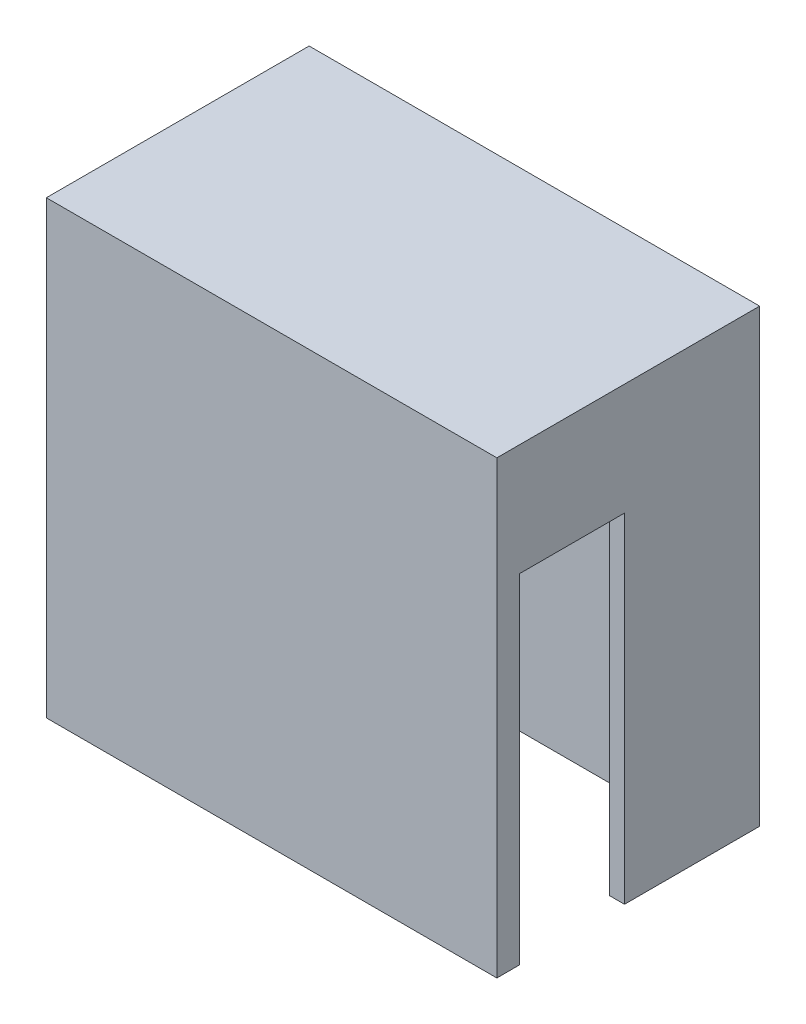
ISO-10303-21;
HEADER;
FILE_DESCRIPTION(('STEP AP214'),'2;1');
FILE_NAME('part.step','',(''),(''),'','','');
FILE_SCHEMA(('AUTOMOTIVE_DESIGN { 1 0 10303 214 1 1 1 1 }'));
ENDSEC;
DATA;
#1=APPLICATION_CONTEXT('core data for automotive mechanical design processes');
#2=APPLICATION_PROTOCOL_DEFINITION('international standard','automotive_design',2000,#1);
#3=PRODUCT_CONTEXT('',#1,'mechanical');
#4=PRODUCT('Part','Part','',(#3));
#5=PRODUCT_RELATED_PRODUCT_CATEGORY('part','',(#4));
#6=PRODUCT_DEFINITION_FORMATION('','',#4);
#7=PRODUCT_DEFINITION_CONTEXT('part definition',#1,'design');
#8=PRODUCT_DEFINITION('design','',#6,#7);
#9=PRODUCT_DEFINITION_SHAPE('','',#8);
#10=(LENGTH_UNIT() NAMED_UNIT(*) SI_UNIT(.MILLI.,.METRE.));
#11=(NAMED_UNIT(*) PLANE_ANGLE_UNIT() SI_UNIT($,.RADIAN.));
#12=(NAMED_UNIT(*) SI_UNIT($,.STERADIAN.) SOLID_ANGLE_UNIT());
#13=UNCERTAINTY_MEASURE_WITH_UNIT(LENGTH_MEASURE(1.E-05),#10,'distance_accuracy_value','');
#14=(GEOMETRIC_REPRESENTATION_CONTEXT(3) GLOBAL_UNCERTAINTY_ASSIGNED_CONTEXT((#13)) GLOBAL_UNIT_ASSIGNED_CONTEXT((#10,
#11,#12)) REPRESENTATION_CONTEXT('',''));
#15=CARTESIAN_POINT('',(0.,0.,0.));
#16=DIRECTION('',(0.,0.,1.));
#17=DIRECTION('',(1.,0.,0.));
#18=AXIS2_PLACEMENT_3D('',#15,#16,#17);
#19=CARTESIAN_POINT('',(0.,0.,0.));
#20=DIRECTION('',(0.,-1.,0.));
#21=DIRECTION('',(0.,0.,-1.));
#22=AXIS2_PLACEMENT_3D('',#19,#20,#21);
#23=PLANE('',#22);
#24=DIRECTION('',(-1.,0.,0.));
#25=VECTOR('',#24,1.);
#26=CARTESIAN_POINT('',(0.,0.,-1.90527528584734));
#27=LINE('',#26,#25);
#28=CARTESIAN_POINT('',(38.1,0.,-1.90527528584734));
#29=VERTEX_POINT('',#28);
#30=CARTESIAN_POINT('',(0.,0.,-1.90527528584734));
#31=VERTEX_POINT('',#30);
#32=EDGE_CURVE('E11',#29,#31,#27,.T.);
#33=ORIENTED_EDGE('',*,*,#32,.F.);
#34=DIRECTION('',(0.,0.,-1.));
#35=VECTOR('',#34,1.);
#36=CARTESIAN_POINT('',(38.1,0.,0.));
#37=LINE('',#36,#35);
#38=CARTESIAN_POINT('',(38.1,0.,0.));
#39=VERTEX_POINT('',#38);
#40=EDGE_CURVE('E168',#39,#29,#37,.T.);
#41=ORIENTED_EDGE('',*,*,#40,.F.);
#42=DIRECTION('',(1.,0.,0.));
#43=VECTOR('',#42,1.);
#44=CARTESIAN_POINT('',(0.,0.,0.));
#45=LINE('',#44,#43);
#46=CARTESIAN_POINT('',(0.,0.,0.));
#47=VERTEX_POINT('',#46);
#48=EDGE_CURVE('E243',#47,#39,#45,.T.);
#49=ORIENTED_EDGE('',*,*,#48,.F.);
#50=DIRECTION('',(0.,0.,-1.));
#51=VECTOR('',#50,1.);
#52=CARTESIAN_POINT('',(0.,0.,0.));
#53=LINE('',#52,#51);
#54=EDGE_CURVE('E254',#47,#31,#53,.T.);
#55=ORIENTED_EDGE('',*,*,#54,.T.);
#56=EDGE_LOOP('',(#33,#41,#49,#55));
#57=FACE_BOUND('',#56,.T.);
#58=ADVANCED_FACE('F39',(#57),#23,.T.);
#59=CARTESIAN_POINT('',(0.,38.1,0.));
#60=DIRECTION('',(-1.,0.,0.));
#61=DIRECTION('',(0.,0.,1.));
#62=AXIS2_PLACEMENT_3D('',#59,#60,#61);
#63=PLANE('',#62);
#64=DIRECTION('',(0.,1.,0.));
#65=VECTOR('',#64,1.);
#66=CARTESIAN_POINT('',(0.,-0.553922956804786,-1.90527528584734));
#67=LINE('',#66,#65);
#68=CARTESIAN_POINT('',(0.,28.6560770431952,-1.90527528584734));
#69=VERTEX_POINT('',#68);
#70=EDGE_CURVE('E147',#31,#69,#67,.T.);
#71=ORIENTED_EDGE('',*,*,#70,.F.);
#72=ORIENTED_EDGE('',*,*,#54,.F.);
#73=DIRECTION('',(0.,-1.,0.));
#74=VECTOR('',#73,1.);
#75=CARTESIAN_POINT('',(0.,38.1,0.));
#76=LINE('',#75,#74);
#77=CARTESIAN_POINT('',(0.,38.1,0.));
#78=VERTEX_POINT('',#77);
#79=EDGE_CURVE('E267',#78,#47,#76,.T.);
#80=ORIENTED_EDGE('',*,*,#79,.F.);
#81=DIRECTION('',(0.,0.,-1.));
#82=VECTOR('',#81,1.);
#83=CARTESIAN_POINT('',(0.,38.1,0.));
#84=LINE('',#83,#82);
#85=CARTESIAN_POINT('',(0.,38.1,-22.225));
#86=VERTEX_POINT('',#85);
#87=EDGE_CURVE('E238',#78,#86,#84,.T.);
#88=ORIENTED_EDGE('',*,*,#87,.T.);
#89=DIRECTION('',(0.,-1.,0.));
#90=VECTOR('',#89,1.);
#91=CARTESIAN_POINT('',(0.,38.1,-22.225));
#92=LINE('',#91,#90);
#93=CARTESIAN_POINT('',(0.,0.,-22.225));
#94=VERTEX_POINT('',#93);
#95=EDGE_CURVE('E253',#86,#94,#92,.T.);
#96=ORIENTED_EDGE('',*,*,#95,.T.);
#97=CARTESIAN_POINT('',(0.,0.,-10.7952752858473));
#98=VERTEX_POINT('',#97);
#99=EDGE_CURVE('E228',#98,#94,#53,.T.);
#100=ORIENTED_EDGE('',*,*,#99,.F.);
#101=DIRECTION('',(0.,-1.,0.));
#102=VECTOR('',#101,1.);
#103=CARTESIAN_POINT('',(0.,-0.553922956804787,-10.7952752858473));
#104=LINE('',#103,#102);
#105=CARTESIAN_POINT('',(0.,28.6560770431952,-10.7952752858473));
#106=VERTEX_POINT('',#105);
#107=EDGE_CURVE('E170',#106,#98,#104,.T.);
#108=ORIENTED_EDGE('',*,*,#107,.F.);
#109=DIRECTION('',(0.,0.,-1.));
#110=VECTOR('',#109,1.);
#111=CARTESIAN_POINT('',(0.,28.6560770431952,-1.90527528584734));
#112=LINE('',#111,#110);
#113=EDGE_CURVE('E173',#69,#106,#112,.T.);
#114=ORIENTED_EDGE('',*,*,#113,.F.);
#115=EDGE_LOOP('',(#71,#72,#80,#88,#96,#100,#108,#114));
#116=FACE_BOUND('',#115,.T.);
#117=ADVANCED_FACE('F41',(#116),#63,.T.);
#118=CARTESIAN_POINT('',(0.,38.1,0.));
#119=DIRECTION('',(0.,0.,-1.));
#120=DIRECTION('',(-1.,0.,0.));
#121=AXIS2_PLACEMENT_3D('',#118,#119,#120);
#122=PLANE('',#121);
#123=ORIENTED_EDGE('',*,*,#48,.T.);
#124=DIRECTION('',(0.,-1.,0.));
#125=VECTOR('',#124,1.);
#126=CARTESIAN_POINT('',(38.1,38.1,0.));
#127=LINE('',#126,#125);
#128=CARTESIAN_POINT('',(38.1,38.1,0.));
#129=VERTEX_POINT('',#128);
#130=EDGE_CURVE('E271',#129,#39,#127,.T.);
#131=ORIENTED_EDGE('',*,*,#130,.F.);
#132=DIRECTION('',(1.,0.,0.));
#133=VECTOR('',#132,1.);
#134=CARTESIAN_POINT('',(0.,38.1,0.));
#135=LINE('',#134,#133);
#136=EDGE_CURVE('E250',#78,#129,#135,.T.);
#137=ORIENTED_EDGE('',*,*,#136,.F.);
#138=ORIENTED_EDGE('',*,*,#79,.T.);
#139=EDGE_LOOP('',(#123,#131,#137,#138));
#140=FACE_BOUND('',#139,.T.);
#141=ADVANCED_FACE('F333',(#140),#122,.F.);
#142=CARTESIAN_POINT('',(38.1,38.1,0.));
#143=DIRECTION('',(-1.,0.,0.));
#144=DIRECTION('',(0.,0.,1.));
#145=AXIS2_PLACEMENT_3D('',#142,#143,#144);
#146=PLANE('',#145);
#147=ORIENTED_EDGE('',*,*,#40,.T.);
#148=DIRECTION('',(0.,1.,0.));
#149=VECTOR('',#148,1.);
#150=CARTESIAN_POINT('',(38.1,-0.553922956804786,-1.90527528584734));
#151=LINE('',#150,#149);
#152=CARTESIAN_POINT('',(38.1,28.6560770431952,-1.90527528584734));
#153=VERTEX_POINT('',#152);
#154=EDGE_CURVE('E144',#29,#153,#151,.T.);
#155=ORIENTED_EDGE('',*,*,#154,.T.);
#156=DIRECTION('',(0.,0.,-1.));
#157=VECTOR('',#156,1.);
#158=CARTESIAN_POINT('',(38.1,28.6560770431952,-1.90527528584734));
#159=LINE('',#158,#157);
#160=CARTESIAN_POINT('',(38.1,28.6560770431952,-10.7952752858473));
#161=VERTEX_POINT('',#160);
#162=EDGE_CURVE('E155',#153,#161,#159,.T.);
#163=ORIENTED_EDGE('',*,*,#162,.T.);
#164=DIRECTION('',(0.,-1.,0.));
#165=VECTOR('',#164,1.);
#166=CARTESIAN_POINT('',(38.1,-0.553922956804787,-10.7952752858473));
#167=LINE('',#166,#165);
#168=CARTESIAN_POINT('',(38.1,0.,-10.7952752858473));
#169=VERTEX_POINT('',#168);
#170=EDGE_CURVE('E152',#161,#169,#167,.T.);
#171=ORIENTED_EDGE('',*,*,#170,.T.);
#172=CARTESIAN_POINT('',(38.1,0.,-22.225));
#173=VERTEX_POINT('',#172);
#174=EDGE_CURVE('E262',#169,#173,#37,.T.);
#175=ORIENTED_EDGE('',*,*,#174,.T.);
#176=DIRECTION('',(0.,-1.,0.));
#177=VECTOR('',#176,1.);
#178=CARTESIAN_POINT('',(38.1,38.1,-22.225));
#179=LINE('',#178,#177);
#180=CARTESIAN_POINT('',(38.1,38.1,-22.225));
#181=VERTEX_POINT('',#180);
#182=EDGE_CURVE('E274',#181,#173,#179,.T.);
#183=ORIENTED_EDGE('',*,*,#182,.F.);
#184=DIRECTION('',(0.,0.,-1.));
#185=VECTOR('',#184,1.);
#186=CARTESIAN_POINT('',(38.1,38.1,0.));
#187=LINE('',#186,#185);
#188=EDGE_CURVE('E247',#129,#181,#187,.T.);
#189=ORIENTED_EDGE('',*,*,#188,.F.);
#190=ORIENTED_EDGE('',*,*,#130,.T.);
#191=EDGE_LOOP('',(#147,#155,#163,#171,#175,#183,#189,#190));
#192=FACE_BOUND('',#191,.T.);
#193=ADVANCED_FACE('F165',(#192),#146,.F.);
#194=CARTESIAN_POINT('',(0.,38.1,-22.225));
#195=DIRECTION('',(0.,0.,-1.));
#196=DIRECTION('',(-1.,0.,0.));
#197=AXIS2_PLACEMENT_3D('',#194,#195,#196);
#198=PLANE('',#197);
#199=DIRECTION('',(1.,0.,0.));
#200=VECTOR('',#199,1.);
#201=CARTESIAN_POINT('',(0.,0.,-22.225));
#202=LINE('',#201,#200);
#203=EDGE_CURVE('E258',#94,#173,#202,.T.);
#204=ORIENTED_EDGE('',*,*,#203,.F.);
#205=ORIENTED_EDGE('',*,*,#95,.F.);
#206=DIRECTION('',(1.,0.,0.));
#207=VECTOR('',#206,1.);
#208=CARTESIAN_POINT('',(0.,38.1,-22.225));
#209=LINE('',#208,#207);
#210=EDGE_CURVE('E242',#86,#181,#209,.T.);
#211=ORIENTED_EDGE('',*,*,#210,.T.);
#212=ORIENTED_EDGE('',*,*,#182,.T.);
#213=EDGE_LOOP('',(#204,#205,#211,#212));
#214=FACE_BOUND('',#213,.T.);
#215=ADVANCED_FACE('F342',(#214),#198,.T.);
#216=CARTESIAN_POINT('',(0.,38.1,0.));
#217=DIRECTION('',(0.,-1.,0.));
#218=DIRECTION('',(0.,0.,-1.));
#219=AXIS2_PLACEMENT_3D('',#216,#217,#218);
#220=PLANE('',#219);
#221=ORIENTED_EDGE('',*,*,#87,.F.);
#222=ORIENTED_EDGE('',*,*,#136,.T.);
#223=ORIENTED_EDGE('',*,*,#188,.T.);
#224=ORIENTED_EDGE('',*,*,#210,.F.);
#225=EDGE_LOOP('',(#221,#222,#223,#224));
#226=FACE_BOUND('',#225,.T.);
#227=ADVANCED_FACE('F337',(#226),#220,.F.);
#228=DIRECTION('',(1.,0.,0.));
#229=VECTOR('',#228,1.);
#230=CARTESIAN_POINT('',(0.,0.,-10.7952752858473));
#231=LINE('',#230,#229);
#232=CARTESIAN_POINT('',(1.27,0.,-10.7952752858473));
#233=VERTEX_POINT('',#232);
#234=EDGE_CURVE('E194',#98,#233,#231,.T.);
#235=ORIENTED_EDGE('',*,*,#234,.F.);
#236=ORIENTED_EDGE('',*,*,#99,.T.);
#237=ORIENTED_EDGE('',*,*,#203,.T.);
#238=ORIENTED_EDGE('',*,*,#174,.F.);
#239=CARTESIAN_POINT('',(36.83,0.,-10.7952752858473));
#240=VERTEX_POINT('',#239);
#241=EDGE_CURVE('E190',#240,#169,#231,.T.);
#242=ORIENTED_EDGE('',*,*,#241,.F.);
#243=DIRECTION('',(0.,0.,1.));
#244=VECTOR('',#243,1.);
#245=CARTESIAN_POINT('',(36.83,0.,-19.05));
#246=LINE('',#245,#244);
#247=CARTESIAN_POINT('',(36.83,0.,-19.05));
#248=VERTEX_POINT('',#247);
#249=EDGE_CURVE('E202',#248,#240,#246,.T.);
#250=ORIENTED_EDGE('',*,*,#249,.F.);
#251=DIRECTION('',(1.,0.,0.));
#252=VECTOR('',#251,1.);
#253=CARTESIAN_POINT('',(1.27,0.,-19.05));
#254=LINE('',#253,#252);
#255=CARTESIAN_POINT('',(1.27,0.,-19.05));
#256=VERTEX_POINT('',#255);
#257=EDGE_CURVE('E217',#256,#248,#254,.T.);
#258=ORIENTED_EDGE('',*,*,#257,.F.);
#259=DIRECTION('',(0.,0.,-1.));
#260=VECTOR('',#259,1.);
#261=CARTESIAN_POINT('',(1.27,0.,-19.05));
#262=LINE('',#261,#260);
#263=EDGE_CURVE('E63',#233,#256,#262,.T.);
#264=ORIENTED_EDGE('',*,*,#263,.F.);
#265=EDGE_LOOP('',(#235,#236,#237,#238,#242,#250,#258,#264));
#266=FACE_BOUND('',#265,.T.);
#267=ADVANCED_FACE('F293',(#266),#23,.T.);
#268=CARTESIAN_POINT('',(1.27,31.75,-19.05));
#269=DIRECTION('',(-1.,0.,0.));
#270=DIRECTION('',(0.,0.,1.));
#271=AXIS2_PLACEMENT_3D('',#268,#269,#270);
#272=PLANE('',#271);
#273=DIRECTION('',(0.,0.,-1.));
#274=VECTOR('',#273,1.);
#275=CARTESIAN_POINT('',(1.27,28.6560770431952,-19.05));
#276=LINE('',#275,#274);
#277=CARTESIAN_POINT('',(1.27,28.6560770431952,-6.35));
#278=VERTEX_POINT('',#277);
#279=CARTESIAN_POINT('',(1.27000000000001,28.6560770431952,-10.7952752858473));
#280=VERTEX_POINT('',#279);
#281=EDGE_CURVE('E186',#278,#280,#276,.T.);
#282=ORIENTED_EDGE('',*,*,#281,.T.);
#283=DIRECTION('',(0.,-1.,0.));
#284=VECTOR('',#283,1.);
#285=CARTESIAN_POINT('',(1.27,31.75,-10.7952752858473));
#286=LINE('',#285,#284);
#287=EDGE_CURVE('E193',#280,#233,#286,.T.);
#288=ORIENTED_EDGE('',*,*,#287,.T.);
#289=ORIENTED_EDGE('',*,*,#263,.T.);
#290=DIRECTION('',(0.,-1.,0.));
#291=VECTOR('',#290,1.);
#292=CARTESIAN_POINT('',(1.27,31.75,-19.05));
#293=LINE('',#292,#291);
#294=CARTESIAN_POINT('',(1.27,31.75,-19.05));
#295=VERTEX_POINT('',#294);
#296=EDGE_CURVE('E214',#295,#256,#293,.T.);
#297=ORIENTED_EDGE('',*,*,#296,.F.);
#298=DIRECTION('',(0.,0.,-1.));
#299=VECTOR('',#298,1.);
#300=CARTESIAN_POINT('',(1.27,31.75,-19.05));
#301=LINE('',#300,#299);
#302=CARTESIAN_POINT('',(1.27,31.75,-6.35));
#303=VERTEX_POINT('',#302);
#304=EDGE_CURVE('E197',#303,#295,#301,.T.);
#305=ORIENTED_EDGE('',*,*,#304,.F.);
#306=DIRECTION('',(0.,-1.,0.));
#307=VECTOR('',#306,1.);
#308=CARTESIAN_POINT('',(1.27,31.75,-6.35));
#309=LINE('',#308,#307);
#310=EDGE_CURVE('E224',#303,#278,#309,.T.);
#311=ORIENTED_EDGE('',*,*,#310,.T.);
#312=EDGE_LOOP('',(#282,#288,#289,#297,#305,#311));
#313=FACE_BOUND('',#312,.T.);
#314=ADVANCED_FACE('F307',(#313),#272,.F.);
#315=CARTESIAN_POINT('',(1.27,31.75,-6.35));
#316=DIRECTION('',(0.,0.,1.));
#317=DIRECTION('',(1.,0.,0.));
#318=AXIS2_PLACEMENT_3D('',#315,#316,#317);
#319=PLANE('',#318);
#320=DIRECTION('',(0.,-1.,0.));
#321=VECTOR('',#320,1.);
#322=CARTESIAN_POINT('',(36.83,31.75,-6.35));
#323=LINE('',#322,#321);
#324=CARTESIAN_POINT('',(36.83,31.75,-6.35));
#325=VERTEX_POINT('',#324);
#326=CARTESIAN_POINT('',(36.83,28.6560770431952,-6.35));
#327=VERTEX_POINT('',#326);
#328=EDGE_CURVE('E229',#325,#327,#323,.T.);
#329=ORIENTED_EDGE('',*,*,#328,.T.);
#330=DIRECTION('',(-1.,0.,0.));
#331=VECTOR('',#330,1.);
#332=CARTESIAN_POINT('',(1.27,28.6560770431952,-6.35));
#333=LINE('',#332,#331);
#334=EDGE_CURVE('E55',#327,#278,#333,.T.);
#335=ORIENTED_EDGE('',*,*,#334,.T.);
#336=ORIENTED_EDGE('',*,*,#310,.F.);
#337=DIRECTION('',(-1.,0.,0.));
#338=VECTOR('',#337,1.);
#339=CARTESIAN_POINT('',(1.27,31.75,-6.35));
#340=LINE('',#339,#338);
#341=EDGE_CURVE('E210',#325,#303,#340,.T.);
#342=ORIENTED_EDGE('',*,*,#341,.F.);
#343=EDGE_LOOP('',(#329,#335,#336,#342));
#344=FACE_BOUND('',#343,.T.);
#345=ADVANCED_FACE('F310',(#344),#319,.F.);
#346=CARTESIAN_POINT('',(36.83,31.75,-19.05));
#347=DIRECTION('',(1.,0.,0.));
#348=DIRECTION('',(0.,0.,-1.));
#349=AXIS2_PLACEMENT_3D('',#346,#347,#348);
#350=PLANE('',#349);
#351=ORIENTED_EDGE('',*,*,#249,.T.);
#352=DIRECTION('',(0.,1.,0.));
#353=VECTOR('',#352,1.);
#354=CARTESIAN_POINT('',(36.83,31.75,-10.7952752858473));
#355=LINE('',#354,#353);
#356=CARTESIAN_POINT('',(36.83,28.6560770431952,-10.7952752858473));
#357=VERTEX_POINT('',#356);
#358=EDGE_CURVE('E48',#240,#357,#355,.T.);
#359=ORIENTED_EDGE('',*,*,#358,.T.);
#360=DIRECTION('',(0.,0.,1.));
#361=VECTOR('',#360,1.);
#362=CARTESIAN_POINT('',(36.83,28.6560770431952,-19.05));
#363=LINE('',#362,#361);
#364=EDGE_CURVE('E270',#357,#327,#363,.T.);
#365=ORIENTED_EDGE('',*,*,#364,.T.);
#366=ORIENTED_EDGE('',*,*,#328,.F.);
#367=DIRECTION('',(0.,0.,1.));
#368=VECTOR('',#367,1.);
#369=CARTESIAN_POINT('',(36.83,31.75,-19.05));
#370=LINE('',#369,#368);
#371=CARTESIAN_POINT('',(36.83,31.75,-19.05));
#372=VERTEX_POINT('',#371);
#373=EDGE_CURVE('E206',#372,#325,#370,.T.);
#374=ORIENTED_EDGE('',*,*,#373,.F.);
#375=DIRECTION('',(0.,-1.,0.));
#376=VECTOR('',#375,1.);
#377=CARTESIAN_POINT('',(36.83,31.75,-19.05));
#378=LINE('',#377,#376);
#379=EDGE_CURVE('E233',#372,#248,#378,.T.);
#380=ORIENTED_EDGE('',*,*,#379,.T.);
#381=EDGE_LOOP('',(#351,#359,#365,#366,#374,#380));
#382=FACE_BOUND('',#381,.T.);
#383=ADVANCED_FACE('F285',(#382),#350,.F.);
#384=CARTESIAN_POINT('',(1.27,31.75,-19.05));
#385=DIRECTION('',(0.,0.,-1.));
#386=DIRECTION('',(-1.,0.,0.));
#387=AXIS2_PLACEMENT_3D('',#384,#385,#386);
#388=PLANE('',#387);
#389=ORIENTED_EDGE('',*,*,#257,.T.);
#390=ORIENTED_EDGE('',*,*,#379,.F.);
#391=DIRECTION('',(1.,0.,0.));
#392=VECTOR('',#391,1.);
#393=CARTESIAN_POINT('',(1.27,31.75,-19.05));
#394=LINE('',#393,#392);
#395=EDGE_CURVE('E201',#295,#372,#394,.T.);
#396=ORIENTED_EDGE('',*,*,#395,.F.);
#397=ORIENTED_EDGE('',*,*,#296,.T.);
#398=EDGE_LOOP('',(#389,#390,#396,#397));
#399=FACE_BOUND('',#398,.T.);
#400=ADVANCED_FACE('F317',(#399),#388,.F.);
#401=CARTESIAN_POINT('',(0.,31.75,0.));
#402=DIRECTION('',(0.,1.,0.));
#403=DIRECTION('',(0.,0.,1.));
#404=AXIS2_PLACEMENT_3D('',#401,#402,#403);
#405=PLANE('',#404);
#406=ORIENTED_EDGE('',*,*,#304,.T.);
#407=ORIENTED_EDGE('',*,*,#395,.T.);
#408=ORIENTED_EDGE('',*,*,#373,.T.);
#409=ORIENTED_EDGE('',*,*,#341,.T.);
#410=EDGE_LOOP('',(#406,#407,#408,#409));
#411=FACE_BOUND('',#410,.T.);
#412=ADVANCED_FACE('F314',(#411),#405,.F.);
#413=CARTESIAN_POINT('',(38.1,-0.553922956804787,-10.7952752858473));
#414=DIRECTION('',(0.,0.,-1.));
#415=DIRECTION('',(-1.,0.,0.));
#416=AXIS2_PLACEMENT_3D('',#413,#414,#415);
#417=PLANE('',#416);
#418=ORIENTED_EDGE('',*,*,#234,.T.);
#419=ORIENTED_EDGE('',*,*,#287,.F.);
#420=DIRECTION('',(-1.,0.,0.));
#421=VECTOR('',#420,1.);
#422=CARTESIAN_POINT('',(38.1,28.6560770431952,-10.7952752858473));
#423=LINE('',#422,#421);
#424=EDGE_CURVE('E151',#280,#106,#423,.T.);
#425=ORIENTED_EDGE('',*,*,#424,.T.);
#426=ORIENTED_EDGE('',*,*,#107,.T.);
#427=EDGE_LOOP('',(#418,#419,#425,#426));
#428=FACE_BOUND('',#427,.T.);
#429=ADVANCED_FACE('F303',(#428),#417,.F.);
#430=CARTESIAN_POINT('',(38.1,28.6560770431952,-1.90527528584734));
#431=DIRECTION('',(0.,1.,0.));
#432=DIRECTION('',(0.,0.,1.));
#433=AXIS2_PLACEMENT_3D('',#430,#431,#432);
#434=PLANE('',#433);
#435=ORIENTED_EDGE('',*,*,#334,.F.);
#436=ORIENTED_EDGE('',*,*,#364,.F.);
#437=EDGE_CURVE('E158',#161,#357,#423,.T.);
#438=ORIENTED_EDGE('',*,*,#437,.F.);
#439=ORIENTED_EDGE('',*,*,#162,.F.);
#440=DIRECTION('',(-1.,0.,0.));
#441=VECTOR('',#440,1.);
#442=CARTESIAN_POINT('',(38.1,28.6560770431952,-1.90527528584734));
#443=LINE('',#442,#441);
#444=EDGE_CURVE('E140',#153,#69,#443,.T.);
#445=ORIENTED_EDGE('',*,*,#444,.T.);
#446=ORIENTED_EDGE('',*,*,#113,.T.);
#447=ORIENTED_EDGE('',*,*,#424,.F.);
#448=ORIENTED_EDGE('',*,*,#281,.F.);
#449=EDGE_LOOP('',(#435,#436,#438,#439,#445,#446,#447,#448));
#450=FACE_BOUND('',#449,.T.);
#451=ADVANCED_FACE('F156',(#450),#434,.F.);
#452=CARTESIAN_POINT('',(38.1,-0.553922956804786,-1.90527528584734));
#453=DIRECTION('',(0.,0.,1.));
#454=DIRECTION('',(1.,0.,0.));
#455=AXIS2_PLACEMENT_3D('',#452,#453,#454);
#456=PLANE('',#455);
#457=ORIENTED_EDGE('',*,*,#32,.T.);
#458=ORIENTED_EDGE('',*,*,#70,.T.);
#459=ORIENTED_EDGE('',*,*,#444,.F.);
#460=ORIENTED_EDGE('',*,*,#154,.F.);
#461=EDGE_LOOP('',(#457,#458,#459,#460));
#462=FACE_BOUND('',#461,.T.);
#463=ADVANCED_FACE('F142',(#462),#456,.F.);
#464=ORIENTED_EDGE('',*,*,#241,.T.);
#465=ORIENTED_EDGE('',*,*,#170,.F.);
#466=ORIENTED_EDGE('',*,*,#437,.T.);
#467=ORIENTED_EDGE('',*,*,#358,.F.);
#468=EDGE_LOOP('',(#464,#465,#466,#467));
#469=FACE_BOUND('',#468,.T.);
#470=ADVANCED_FACE('F289',(#469),#417,.F.);
#471=CLOSED_SHELL('',(#58,#117,#141,#193,#215,#227,#267,#314,#345,#383,#400,#412,#429,#451,#463,#470));
#472=MANIFOLD_SOLID_BREP('B2',#471);
#473=ADVANCED_BREP_SHAPE_REPRESENTATION('',(#18,#472),#14);
#474=SHAPE_DEFINITION_REPRESENTATION(#9,#473);
ENDSEC;
END-ISO-10303-21;
